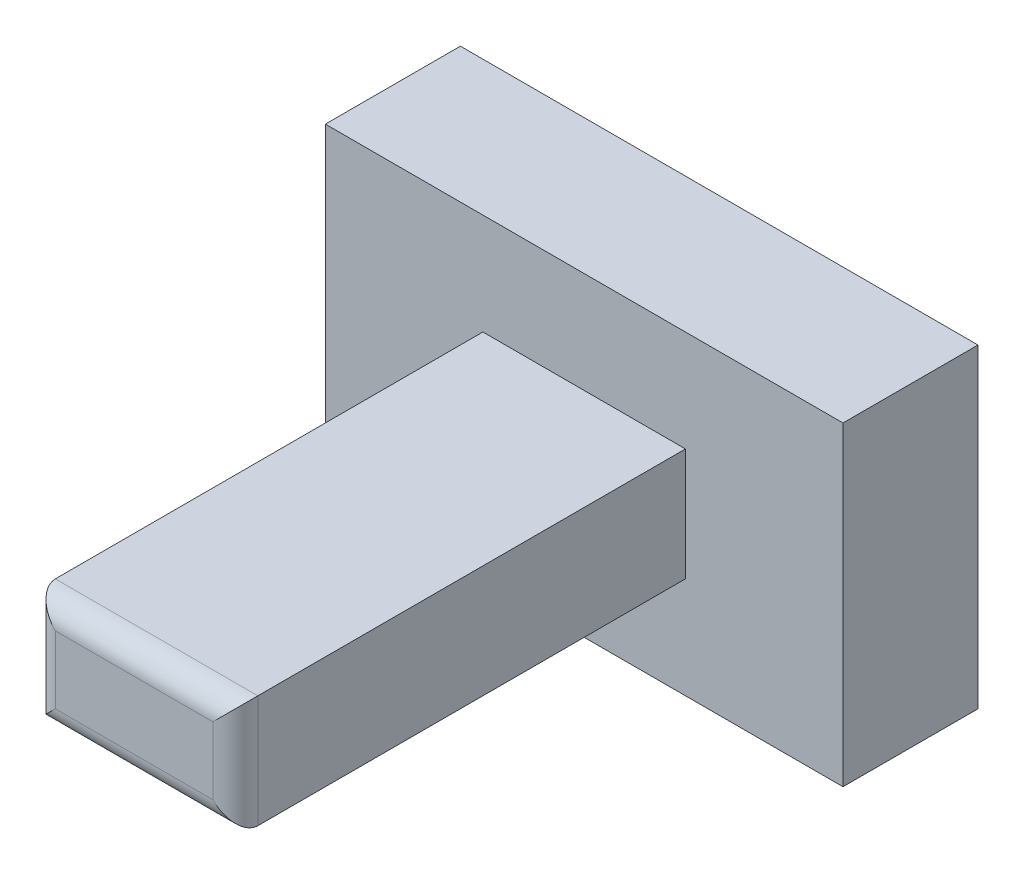
ISO-10303-21;
HEADER;
FILE_DESCRIPTION(('STEP AP214'),'2;1');
FILE_NAME('part.step','',(''),(''),'','','');
FILE_SCHEMA(('AUTOMOTIVE_DESIGN { 1 0 10303 214 1 1 1 1 }'));
ENDSEC;
DATA;
#1=APPLICATION_CONTEXT('core data for automotive mechanical design processes');
#2=APPLICATION_PROTOCOL_DEFINITION('international standard','automotive_design',2000,#1);
#3=PRODUCT_CONTEXT('',#1,'mechanical');
#4=PRODUCT('Part','Part','',(#3));
#5=PRODUCT_RELATED_PRODUCT_CATEGORY('part','',(#4));
#6=PRODUCT_DEFINITION_FORMATION('','',#4);
#7=PRODUCT_DEFINITION_CONTEXT('part definition',#1,'design');
#8=PRODUCT_DEFINITION('design','',#6,#7);
#9=PRODUCT_DEFINITION_SHAPE('','',#8);
#10=(LENGTH_UNIT() NAMED_UNIT(*) SI_UNIT(.MILLI.,.METRE.));
#11=(NAMED_UNIT(*) PLANE_ANGLE_UNIT() SI_UNIT($,.RADIAN.));
#12=(NAMED_UNIT(*) SI_UNIT($,.STERADIAN.) SOLID_ANGLE_UNIT());
#13=UNCERTAINTY_MEASURE_WITH_UNIT(LENGTH_MEASURE(1.E-05),#10,'distance_accuracy_value','');
#14=(GEOMETRIC_REPRESENTATION_CONTEXT(3) GLOBAL_UNCERTAINTY_ASSIGNED_CONTEXT((#13)) GLOBAL_UNIT_ASSIGNED_CONTEXT((#10,
#11,#12)) REPRESENTATION_CONTEXT('',''));
#15=CARTESIAN_POINT('',(0.,0.,0.));
#16=DIRECTION('',(0.,0.,1.));
#17=DIRECTION('',(1.,0.,0.));
#18=AXIS2_PLACEMENT_3D('',#15,#16,#17);
#19=CARTESIAN_POINT('',(0.9,-0.5,4.));
#20=DIRECTION('',(-1.,0.,0.));
#21=DIRECTION('',(0.,0.,1.));
#22=AXIS2_PLACEMENT_3D('',#19,#20,#21);
#23=PLANE('',#22);
#24=DIRECTION('',(0.,0.,-1.));
#25=VECTOR('',#24,1.);
#26=CARTESIAN_POINT('',(0.9,0.5,4.));
#27=LINE('',#26,#25);
#28=CARTESIAN_POINT('',(0.9,0.5,3.8));
#29=VERTEX_POINT('',#28);
#30=CARTESIAN_POINT('',(0.9,0.5,0.));
#31=VERTEX_POINT('',#30);
#32=EDGE_CURVE('E164',#29,#31,#27,.T.);
#33=ORIENTED_EDGE('',*,*,#32,.F.);
#34=DIRECTION('',(0.,1.,0.));
#35=VECTOR('',#34,1.);
#36=CARTESIAN_POINT('',(0.9,-0.5,3.8));
#37=LINE('',#36,#35);
#38=CARTESIAN_POINT('',(0.9,-0.5,3.8));
#39=VERTEX_POINT('',#38);
#40=EDGE_CURVE('E48',#29,#39,#37,.F.);
#41=ORIENTED_EDGE('',*,*,#40,.T.);
#42=DIRECTION('',(0.,0.,-1.));
#43=VECTOR('',#42,1.);
#44=CARTESIAN_POINT('',(0.9,-0.5,4.));
#45=LINE('',#44,#43);
#46=CARTESIAN_POINT('',(0.9,-0.5,0.));
#47=VERTEX_POINT('',#46);
#48=EDGE_CURVE('E158',#39,#47,#45,.T.);
#49=ORIENTED_EDGE('',*,*,#48,.T.);
#50=DIRECTION('',(0.,1.,0.));
#51=VECTOR('',#50,1.);
#52=CARTESIAN_POINT('',(0.9,-0.5,0.));
#53=LINE('',#52,#51);
#54=EDGE_CURVE('E141',#47,#31,#53,.T.);
#55=ORIENTED_EDGE('',*,*,#54,.T.);
#56=EDGE_LOOP('',(#33,#41,#49,#55));
#57=FACE_BOUND('',#56,.T.);
#58=ADVANCED_FACE('F39',(#57),#23,.F.);
#59=CARTESIAN_POINT('',(-0.9,0.5,4.));
#60=DIRECTION('',(0.,-1.,0.));
#61=DIRECTION('',(0.,0.,-1.));
#62=AXIS2_PLACEMENT_3D('',#59,#60,#61);
#63=PLANE('',#62);
#64=DIRECTION('',(0.,0.,-1.));
#65=VECTOR('',#64,1.);
#66=CARTESIAN_POINT('',(-0.9,0.5,4.));
#67=LINE('',#66,#65);
#68=CARTESIAN_POINT('',(-0.9,0.5,3.8));
#69=VERTEX_POINT('',#68);
#70=CARTESIAN_POINT('',(-0.9,0.5,0.));
#71=VERTEX_POINT('',#70);
#72=EDGE_CURVE('E162',#69,#71,#67,.T.);
#73=ORIENTED_EDGE('',*,*,#72,.F.);
#74=DIRECTION('',(-1.,0.,0.));
#75=VECTOR('',#74,1.);
#76=CARTESIAN_POINT('',(-0.9,0.5,3.8));
#77=LINE('',#76,#75);
#78=EDGE_CURVE('E11',#69,#29,#77,.F.);
#79=ORIENTED_EDGE('',*,*,#78,.T.);
#80=ORIENTED_EDGE('',*,*,#32,.T.);
#81=DIRECTION('',(-1.,0.,0.));
#82=VECTOR('',#81,1.);
#83=CARTESIAN_POINT('',(-0.9,0.5,0.));
#84=LINE('',#83,#82);
#85=EDGE_CURVE('E144',#31,#71,#84,.T.);
#86=ORIENTED_EDGE('',*,*,#85,.T.);
#87=EDGE_LOOP('',(#73,#79,#80,#86));
#88=FACE_BOUND('',#87,.T.);
#89=ADVANCED_FACE('F224',(#88),#63,.F.);
#90=CARTESIAN_POINT('',(-0.9,-0.5,4.));
#91=DIRECTION('',(1.,0.,0.));
#92=DIRECTION('',(0.,0.,-1.));
#93=AXIS2_PLACEMENT_3D('',#90,#91,#92);
#94=PLANE('',#93);
#95=DIRECTION('',(0.,0.,-1.));
#96=VECTOR('',#95,1.);
#97=CARTESIAN_POINT('',(-0.9,-0.5,4.));
#98=LINE('',#97,#96);
#99=CARTESIAN_POINT('',(-0.9,-0.5,3.8));
#100=VERTEX_POINT('',#99);
#101=CARTESIAN_POINT('',(-0.9,-0.5,0.));
#102=VERTEX_POINT('',#101);
#103=EDGE_CURVE('E160',#100,#102,#98,.T.);
#104=ORIENTED_EDGE('',*,*,#103,.F.);
#105=DIRECTION('',(0.,-1.,0.));
#106=VECTOR('',#105,1.);
#107=CARTESIAN_POINT('',(-0.9,-0.5,3.8));
#108=LINE('',#107,#106);
#109=EDGE_CURVE('E175',#100,#69,#108,.F.);
#110=ORIENTED_EDGE('',*,*,#109,.T.);
#111=ORIENTED_EDGE('',*,*,#72,.T.);
#112=DIRECTION('',(0.,-1.,0.));
#113=VECTOR('',#112,1.);
#114=CARTESIAN_POINT('',(-0.9,-0.5,0.));
#115=LINE('',#114,#113);
#116=EDGE_CURVE('E152',#71,#102,#115,.T.);
#117=ORIENTED_EDGE('',*,*,#116,.T.);
#118=EDGE_LOOP('',(#104,#110,#111,#117));
#119=FACE_BOUND('',#118,.T.);
#120=ADVANCED_FACE('F230',(#119),#94,.F.);
#121=CARTESIAN_POINT('',(-0.9,-0.5,4.));
#122=DIRECTION('',(0.,1.,0.));
#123=DIRECTION('',(0.,0.,1.));
#124=AXIS2_PLACEMENT_3D('',#121,#122,#123);
#125=PLANE('',#124);
#126=ORIENTED_EDGE('',*,*,#48,.F.);
#127=DIRECTION('',(1.,0.,0.));
#128=VECTOR('',#127,1.);
#129=CARTESIAN_POINT('',(-0.9,-0.5,3.8));
#130=LINE('',#129,#128);
#131=EDGE_CURVE('E178',#39,#100,#130,.F.);
#132=ORIENTED_EDGE('',*,*,#131,.T.);
#133=ORIENTED_EDGE('',*,*,#103,.T.);
#134=DIRECTION('',(1.,0.,0.));
#135=VECTOR('',#134,1.);
#136=CARTESIAN_POINT('',(-0.9,-0.5,0.));
#137=LINE('',#136,#135);
#138=EDGE_CURVE('E155',#102,#47,#137,.T.);
#139=ORIENTED_EDGE('',*,*,#138,.T.);
#140=EDGE_LOOP('',(#126,#132,#133,#139));
#141=FACE_BOUND('',#140,.T.);
#142=ADVANCED_FACE('F254',(#141),#125,.F.);
#143=CARTESIAN_POINT('',(0.,0.,4.));
#144=DIRECTION('',(0.,0.,-1.));
#145=DIRECTION('',(-1.,0.,0.));
#146=AXIS2_PLACEMENT_3D('',#143,#144,#145);
#147=PLANE('',#146);
#148=DIRECTION('',(-1.,0.,0.));
#149=VECTOR('',#148,1.);
#150=CARTESIAN_POINT('',(0.,0.3,4.));
#151=LINE('',#150,#149);
#152=CARTESIAN_POINT('',(0.7,0.3,4.));
#153=VERTEX_POINT('',#152);
#154=CARTESIAN_POINT('',(-0.7,0.3,4.));
#155=VERTEX_POINT('',#154);
#156=EDGE_CURVE('E166',#153,#155,#151,.T.);
#157=ORIENTED_EDGE('',*,*,#156,.T.);
#158=DIRECTION('',(0.,-1.,0.));
#159=VECTOR('',#158,1.);
#160=CARTESIAN_POINT('',(-0.7,0.,4.));
#161=LINE('',#160,#159);
#162=CARTESIAN_POINT('',(-0.7,-0.3,4.));
#163=VERTEX_POINT('',#162);
#164=EDGE_CURVE('E172',#155,#163,#161,.T.);
#165=ORIENTED_EDGE('',*,*,#164,.T.);
#166=DIRECTION('',(1.,0.,0.));
#167=VECTOR('',#166,1.);
#168=CARTESIAN_POINT('',(0.,-0.3,4.));
#169=LINE('',#168,#167);
#170=CARTESIAN_POINT('',(0.7,-0.3,4.));
#171=VERTEX_POINT('',#170);
#172=EDGE_CURVE('E170',#163,#171,#169,.T.);
#173=ORIENTED_EDGE('',*,*,#172,.T.);
#174=DIRECTION('',(0.,1.,0.));
#175=VECTOR('',#174,1.);
#176=CARTESIAN_POINT('',(0.7,0.,4.));
#177=LINE('',#176,#175);
#178=EDGE_CURVE('E168',#171,#153,#177,.T.);
#179=ORIENTED_EDGE('',*,*,#178,.T.);
#180=EDGE_LOOP('',(#157,#165,#173,#179));
#181=FACE_BOUND('',#180,.T.);
#182=ADVANCED_FACE('F262',(#181),#147,.F.);
#183=CARTESIAN_POINT('',(0.,0.,0.));
#184=DIRECTION('',(0.,0.,1.));
#185=DIRECTION('',(1.,0.,0.));
#186=AXIS2_PLACEMENT_3D('',#183,#184,#185);
#187=PLANE('',#186);
#188=DIRECTION('',(0.,1.,0.));
#189=VECTOR('',#188,1.);
#190=CARTESIAN_POINT('',(-2.3,-1.4,0.));
#191=LINE('',#190,#189);
#192=CARTESIAN_POINT('',(-2.3,-1.4,0.));
#193=VERTEX_POINT('',#192);
#194=CARTESIAN_POINT('',(-2.3,1.4,0.));
#195=VERTEX_POINT('',#194);
#196=EDGE_CURVE('E140',#193,#195,#191,.T.);
#197=ORIENTED_EDGE('',*,*,#196,.F.);
#198=DIRECTION('',(-1.,0.,0.));
#199=VECTOR('',#198,1.);
#200=CARTESIAN_POINT('',(2.3,-1.4,0.));
#201=LINE('',#200,#199);
#202=CARTESIAN_POINT('',(2.3,-1.4,0.));
#203=VERTEX_POINT('',#202);
#204=EDGE_CURVE('E136',#203,#193,#201,.T.);
#205=ORIENTED_EDGE('',*,*,#204,.F.);
#206=DIRECTION('',(0.,-1.,0.));
#207=VECTOR('',#206,1.);
#208=CARTESIAN_POINT('',(2.3,-1.4,0.));
#209=LINE('',#208,#207);
#210=CARTESIAN_POINT('',(2.3,1.4,0.));
#211=VERTEX_POINT('',#210);
#212=EDGE_CURVE('E196',#211,#203,#209,.T.);
#213=ORIENTED_EDGE('',*,*,#212,.F.);
#214=DIRECTION('',(1.,0.,0.));
#215=VECTOR('',#214,1.);
#216=CARTESIAN_POINT('',(2.3,1.4,0.));
#217=LINE('',#216,#215);
#218=EDGE_CURVE('E194',#195,#211,#217,.T.);
#219=ORIENTED_EDGE('',*,*,#218,.F.);
#220=EDGE_LOOP('',(#197,#205,#213,#219));
#221=FACE_BOUND('',#220,.T.);
#222=ORIENTED_EDGE('',*,*,#54,.F.);
#223=ORIENTED_EDGE('',*,*,#138,.F.);
#224=ORIENTED_EDGE('',*,*,#116,.F.);
#225=ORIENTED_EDGE('',*,*,#85,.F.);
#226=EDGE_LOOP('',(#222,#223,#224,#225));
#227=FACE_BOUND('',#226,.T.);
#228=ADVANCED_FACE('F212',(#221,#227),#187,.T.);
#229=CARTESIAN_POINT('',(-2.3,-1.4,-1.2));
#230=DIRECTION('',(1.,0.,0.));
#231=DIRECTION('',(0.,0.,-1.));
#232=AXIS2_PLACEMENT_3D('',#229,#230,#231);
#233=PLANE('',#232);
#234=ORIENTED_EDGE('',*,*,#196,.T.);
#235=DIRECTION('',(0.,0.,1.));
#236=VECTOR('',#235,1.);
#237=CARTESIAN_POINT('',(-2.3,1.4,-1.2));
#238=LINE('',#237,#236);
#239=CARTESIAN_POINT('',(-2.3,1.4,-1.2));
#240=VERTEX_POINT('',#239);
#241=EDGE_CURVE('E120',#240,#195,#238,.T.);
#242=ORIENTED_EDGE('',*,*,#241,.F.);
#243=DIRECTION('',(0.,1.,0.));
#244=VECTOR('',#243,1.);
#245=CARTESIAN_POINT('',(-2.3,-1.4,-1.2));
#246=LINE('',#245,#244);
#247=CARTESIAN_POINT('',(-2.3,-1.4,-1.2));
#248=VERTEX_POINT('',#247);
#249=EDGE_CURVE('E127',#248,#240,#246,.T.);
#250=ORIENTED_EDGE('',*,*,#249,.F.);
#251=DIRECTION('',(0.,0.,1.));
#252=VECTOR('',#251,1.);
#253=CARTESIAN_POINT('',(-2.3,-1.4,-1.2));
#254=LINE('',#253,#252);
#255=EDGE_CURVE('E203',#248,#193,#254,.T.);
#256=ORIENTED_EDGE('',*,*,#255,.T.);
#257=EDGE_LOOP('',(#234,#242,#250,#256));
#258=FACE_BOUND('',#257,.T.);
#259=ADVANCED_FACE('F138',(#258),#233,.F.);
#260=CARTESIAN_POINT('',(2.3,1.4,-1.2));
#261=DIRECTION('',(0.,-1.,0.));
#262=DIRECTION('',(0.,0.,-1.));
#263=AXIS2_PLACEMENT_3D('',#260,#261,#262);
#264=PLANE('',#263);
#265=ORIENTED_EDGE('',*,*,#218,.T.);
#266=DIRECTION('',(0.,0.,1.));
#267=VECTOR('',#266,1.);
#268=CARTESIAN_POINT('',(2.3,1.4,-1.2));
#269=LINE('',#268,#267);
#270=CARTESIAN_POINT('',(2.3,1.4,-1.2));
#271=VERTEX_POINT('',#270);
#272=EDGE_CURVE('E123',#271,#211,#269,.T.);
#273=ORIENTED_EDGE('',*,*,#272,.F.);
#274=DIRECTION('',(1.,0.,0.));
#275=VECTOR('',#274,1.);
#276=CARTESIAN_POINT('',(2.3,1.4,-1.2));
#277=LINE('',#276,#275);
#278=EDGE_CURVE('E116',#240,#271,#277,.T.);
#279=ORIENTED_EDGE('',*,*,#278,.F.);
#280=ORIENTED_EDGE('',*,*,#241,.T.);
#281=EDGE_LOOP('',(#265,#273,#279,#280));
#282=FACE_BOUND('',#281,.T.);
#283=ADVANCED_FACE('F118',(#282),#264,.F.);
#284=CARTESIAN_POINT('',(2.3,-1.4,-1.2));
#285=DIRECTION('',(-1.,0.,0.));
#286=DIRECTION('',(0.,0.,1.));
#287=AXIS2_PLACEMENT_3D('',#284,#285,#286);
#288=PLANE('',#287);
#289=ORIENTED_EDGE('',*,*,#212,.T.);
#290=DIRECTION('',(0.,0.,1.));
#291=VECTOR('',#290,1.);
#292=CARTESIAN_POINT('',(2.3,-1.4,-1.2));
#293=LINE('',#292,#291);
#294=CARTESIAN_POINT('',(2.3,-1.4,-1.2));
#295=VERTEX_POINT('',#294);
#296=EDGE_CURVE('E146',#295,#203,#293,.T.);
#297=ORIENTED_EDGE('',*,*,#296,.F.);
#298=DIRECTION('',(0.,-1.,0.));
#299=VECTOR('',#298,1.);
#300=CARTESIAN_POINT('',(2.3,-1.4,-1.2));
#301=LINE('',#300,#299);
#302=EDGE_CURVE('E126',#271,#295,#301,.T.);
#303=ORIENTED_EDGE('',*,*,#302,.F.);
#304=ORIENTED_EDGE('',*,*,#272,.T.);
#305=EDGE_LOOP('',(#289,#297,#303,#304));
#306=FACE_BOUND('',#305,.T.);
#307=ADVANCED_FACE('F214',(#306),#288,.F.);
#308=CARTESIAN_POINT('',(2.3,-1.4,-1.2));
#309=DIRECTION('',(0.,1.,0.));
#310=DIRECTION('',(0.,0.,1.));
#311=AXIS2_PLACEMENT_3D('',#308,#309,#310);
#312=PLANE('',#311);
#313=ORIENTED_EDGE('',*,*,#204,.T.);
#314=ORIENTED_EDGE('',*,*,#255,.F.);
#315=DIRECTION('',(-1.,0.,0.));
#316=VECTOR('',#315,1.);
#317=CARTESIAN_POINT('',(2.3,-1.4,-1.2));
#318=LINE('',#317,#316);
#319=EDGE_CURVE('E132',#295,#248,#318,.T.);
#320=ORIENTED_EDGE('',*,*,#319,.F.);
#321=ORIENTED_EDGE('',*,*,#296,.T.);
#322=EDGE_LOOP('',(#313,#314,#320,#321));
#323=FACE_BOUND('',#322,.T.);
#324=ADVANCED_FACE('F208',(#323),#312,.F.);
#325=CARTESIAN_POINT('',(0.,0.,-1.2));
#326=DIRECTION('',(0.,0.,1.));
#327=DIRECTION('',(1.,0.,0.));
#328=AXIS2_PLACEMENT_3D('',#325,#326,#327);
#329=PLANE('',#328);
#330=ORIENTED_EDGE('',*,*,#249,.T.);
#331=ORIENTED_EDGE('',*,*,#278,.T.);
#332=ORIENTED_EDGE('',*,*,#302,.T.);
#333=ORIENTED_EDGE('',*,*,#319,.T.);
#334=EDGE_LOOP('',(#330,#331,#332,#333));
#335=FACE_BOUND('',#334,.T.);
#336=ADVANCED_FACE('F130',(#335),#329,.F.);
#337=CARTESIAN_POINT('',(0.7,0.,3.8));
#338=DIRECTION('',(0.,1.,0.));
#339=DIRECTION('',(0.,0.,1.));
#340=AXIS2_PLACEMENT_3D('',#337,#338,#339);
#341=CYLINDRICAL_SURFACE('',#340,0.2);
#342=CARTESIAN_POINT('',(0.7,-0.3,3.8));
#343=DIRECTION('',(0.707106781186547,0.707106781186547,0.));
#344=DIRECTION('',(-0.707106781186547,0.707106781186547,0.));
#345=AXIS2_PLACEMENT_3D('',#342,#343,#344);
#346=ELLIPSE('',#345,0.282842712474619,0.2);
#347=EDGE_CURVE('E184',#39,#171,#346,.F.);
#348=ORIENTED_EDGE('',*,*,#347,.F.);
#349=ORIENTED_EDGE('',*,*,#40,.F.);
#350=CARTESIAN_POINT('',(0.7,0.3,3.8));
#351=DIRECTION('',(-0.707106781186547,0.707106781186547,0.));
#352=DIRECTION('',(-0.707106781186547,-0.707106781186547,0.));
#353=AXIS2_PLACEMENT_3D('',#350,#351,#352);
#354=ELLIPSE('',#353,0.282842712474619,0.2);
#355=EDGE_CURVE('E43',#153,#29,#354,.T.);
#356=ORIENTED_EDGE('',*,*,#355,.F.);
#357=ORIENTED_EDGE('',*,*,#178,.F.);
#358=EDGE_LOOP('',(#348,#349,#356,#357));
#359=FACE_BOUND('',#358,.T.);
#360=ADVANCED_FACE('F41',(#359),#341,.T.);
#361=CARTESIAN_POINT('',(0.,0.3,3.8));
#362=DIRECTION('',(-1.,0.,0.));
#363=DIRECTION('',(0.,0.,1.));
#364=AXIS2_PLACEMENT_3D('',#361,#362,#363);
#365=CYLINDRICAL_SURFACE('',#364,0.2);
#366=ORIENTED_EDGE('',*,*,#355,.T.);
#367=ORIENTED_EDGE('',*,*,#78,.F.);
#368=CARTESIAN_POINT('',(-0.7,0.3,3.8));
#369=DIRECTION('',(-0.707106781186547,-0.707106781186547,0.));
#370=DIRECTION('',(-0.707106781186547,0.707106781186547,0.));
#371=AXIS2_PLACEMENT_3D('',#368,#369,#370);
#372=ELLIPSE('',#371,0.282842712474619,0.2);
#373=EDGE_CURVE('E183',#155,#69,#372,.T.);
#374=ORIENTED_EDGE('',*,*,#373,.F.);
#375=ORIENTED_EDGE('',*,*,#156,.F.);
#376=EDGE_LOOP('',(#366,#367,#374,#375));
#377=FACE_BOUND('',#376,.T.);
#378=ADVANCED_FACE('F240',(#377),#365,.T.);
#379=CARTESIAN_POINT('',(0.,-0.3,3.8));
#380=DIRECTION('',(1.,0.,0.));
#381=DIRECTION('',(0.,0.,-1.));
#382=AXIS2_PLACEMENT_3D('',#379,#380,#381);
#383=CYLINDRICAL_SURFACE('',#382,0.2);
#384=ORIENTED_EDGE('',*,*,#347,.T.);
#385=ORIENTED_EDGE('',*,*,#172,.F.);
#386=CARTESIAN_POINT('',(-0.7,-0.3,3.8));
#387=DIRECTION('',(0.707106781186547,-0.707106781186547,0.));
#388=DIRECTION('',(0.707106781186547,0.707106781186547,0.));
#389=AXIS2_PLACEMENT_3D('',#386,#387,#388);
#390=ELLIPSE('',#389,0.282842712474619,0.2);
#391=EDGE_CURVE('E181',#100,#163,#390,.F.);
#392=ORIENTED_EDGE('',*,*,#391,.F.);
#393=ORIENTED_EDGE('',*,*,#131,.F.);
#394=EDGE_LOOP('',(#384,#385,#392,#393));
#395=FACE_BOUND('',#394,.T.);
#396=ADVANCED_FACE('F237',(#395),#383,.T.);
#397=CARTESIAN_POINT('',(-0.7,0.,3.8));
#398=DIRECTION('',(0.,-1.,0.));
#399=DIRECTION('',(0.,0.,-1.));
#400=AXIS2_PLACEMENT_3D('',#397,#398,#399);
#401=CYLINDRICAL_SURFACE('',#400,0.2);
#402=ORIENTED_EDGE('',*,*,#373,.T.);
#403=ORIENTED_EDGE('',*,*,#109,.F.);
#404=ORIENTED_EDGE('',*,*,#391,.T.);
#405=ORIENTED_EDGE('',*,*,#164,.F.);
#406=EDGE_LOOP('',(#402,#403,#404,#405));
#407=FACE_BOUND('',#406,.T.);
#408=ADVANCED_FACE('F234',(#407),#401,.T.);
#409=CLOSED_SHELL('',(#58,#89,#120,#142,#182,#228,#259,#283,#307,#324,#336,#360,#378,#396,#408));
#410=MANIFOLD_SOLID_BREP('B2',#409);
#411=ADVANCED_BREP_SHAPE_REPRESENTATION('',(#18,#410),#14);
#412=SHAPE_DEFINITION_REPRESENTATION(#9,#411);
ENDSEC;
END-ISO-10303-21;
